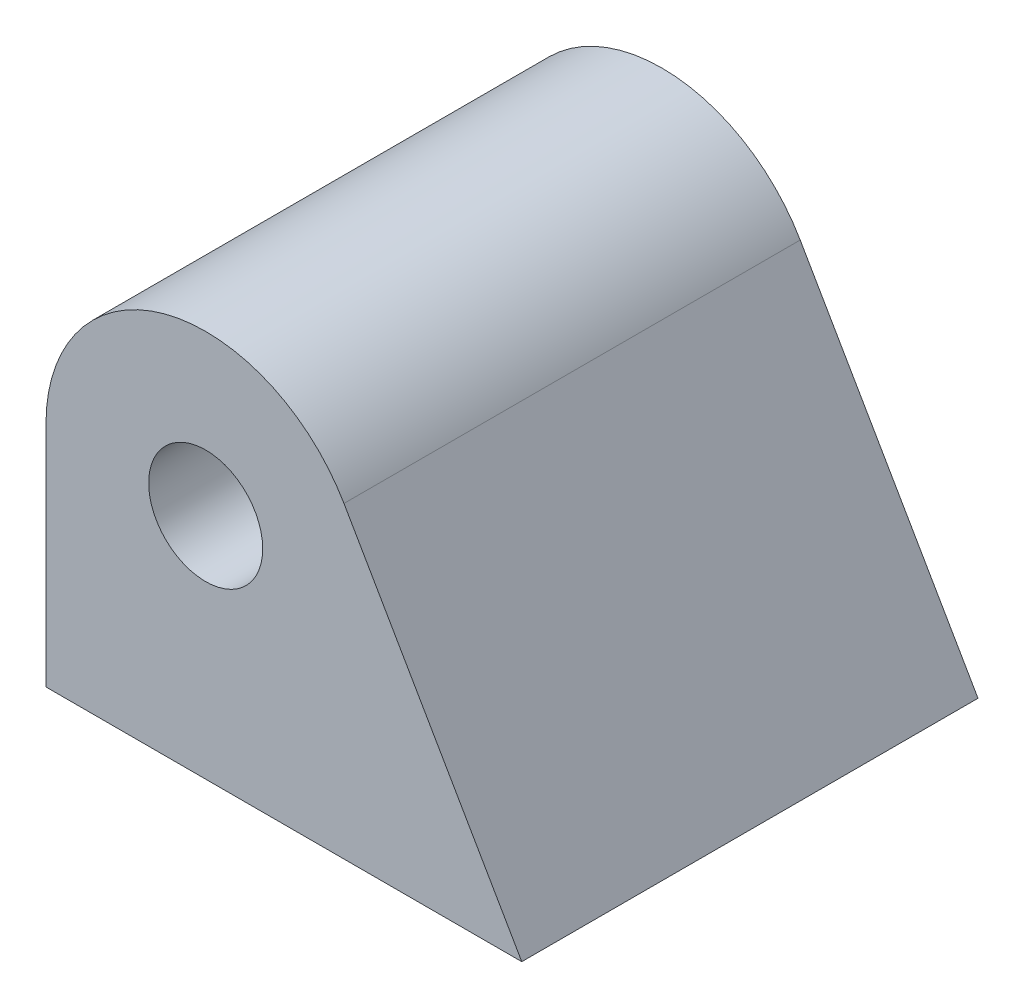
ISO-10303-21;
HEADER;
FILE_DESCRIPTION(('STEP AP214'),'2;1');
FILE_NAME('part.step','',(''),(''),'','','');
FILE_SCHEMA(('AUTOMOTIVE_DESIGN { 1 0 10303 214 1 1 1 1 }'));
ENDSEC;
DATA;
#1=APPLICATION_CONTEXT('core data for automotive mechanical design processes');
#2=APPLICATION_PROTOCOL_DEFINITION('international standard','automotive_design',2000,#1);
#3=PRODUCT_CONTEXT('',#1,'mechanical');
#4=PRODUCT('Part','Part','',(#3));
#5=PRODUCT_RELATED_PRODUCT_CATEGORY('part','',(#4));
#6=PRODUCT_DEFINITION_FORMATION('','',#4);
#7=PRODUCT_DEFINITION_CONTEXT('part definition',#1,'design');
#8=PRODUCT_DEFINITION('design','',#6,#7);
#9=PRODUCT_DEFINITION_SHAPE('','',#8);
#10=(LENGTH_UNIT() NAMED_UNIT(*) SI_UNIT(.MILLI.,.METRE.));
#11=(NAMED_UNIT(*) PLANE_ANGLE_UNIT() SI_UNIT($,.RADIAN.));
#12=(NAMED_UNIT(*) SI_UNIT($,.STERADIAN.) SOLID_ANGLE_UNIT());
#13=UNCERTAINTY_MEASURE_WITH_UNIT(LENGTH_MEASURE(1.E-05),#10,'distance_accuracy_value','');
#14=(GEOMETRIC_REPRESENTATION_CONTEXT(3) GLOBAL_UNCERTAINTY_ASSIGNED_CONTEXT((#13)) GLOBAL_UNIT_ASSIGNED_CONTEXT((#10,
#11,#12)) REPRESENTATION_CONTEXT('',''));
#15=CARTESIAN_POINT('',(0.,0.,0.));
#16=DIRECTION('',(0.,0.,1.));
#17=DIRECTION('',(1.,0.,0.));
#18=AXIS2_PLACEMENT_3D('',#15,#16,#17);
#19=CARTESIAN_POINT('',(8.89,12.7,25.4));
#20=DIRECTION('',(0.,0.,-1.));
#21=DIRECTION('',(-1.,0.,0.));
#22=AXIS2_PLACEMENT_3D('',#19,#20,#21);
#23=PLANE('',#22);
#24=DIRECTION('',(0.,-1.,0.));
#25=VECTOR('',#24,1.);
#26=CARTESIAN_POINT('',(0.,0.,25.4));
#27=LINE('',#26,#25);
#28=CARTESIAN_POINT('',(0.,12.7,25.4));
#29=VERTEX_POINT('',#28);
#30=CARTESIAN_POINT('',(0.,0.,25.4));
#31=VERTEX_POINT('',#30);
#32=EDGE_CURVE('E87',#29,#31,#27,.T.);
#33=ORIENTED_EDGE('',*,*,#32,.T.);
#34=DIRECTION('',(1.,0.,0.));
#35=VECTOR('',#34,1.);
#36=CARTESIAN_POINT('',(0.,0.,25.4));
#37=LINE('',#36,#35);
#38=CARTESIAN_POINT('',(26.4876362048998,0.,25.4));
#39=VERTEX_POINT('',#38);
#40=EDGE_CURVE('E82',#31,#39,#37,.T.);
#41=ORIENTED_EDGE('',*,*,#40,.T.);
#42=DIRECTION('',(-0.500000000000001,0.866025403784438,0.));
#43=VECTOR('',#42,1.);
#44=CARTESIAN_POINT('',(26.4876362048998,0.,25.4));
#45=LINE('',#44,#43);
#46=CARTESIAN_POINT('',(16.5889658396436,17.145,25.4));
#47=VERTEX_POINT('',#46);
#48=EDGE_CURVE('E85',#39,#47,#45,.T.);
#49=ORIENTED_EDGE('',*,*,#48,.T.);
#50=CARTESIAN_POINT('',(8.89,12.7,25.4));
#51=DIRECTION('',(0.,0.,1.));
#52=DIRECTION('',(-1.,0.,0.));
#53=AXIS2_PLACEMENT_3D('',#50,#51,#52);
#54=CIRCLE('',#53,8.88999999999999);
#55=EDGE_CURVE('E52',#47,#29,#54,.T.);
#56=ORIENTED_EDGE('',*,*,#55,.T.);
#57=EDGE_LOOP('',(#33,#41,#49,#56));
#58=FACE_BOUND('',#57,.T.);
#59=CARTESIAN_POINT('',(8.89,12.7,25.4));
#60=DIRECTION('',(0.,0.,1.));
#61=DIRECTION('',(1.,0.,0.));
#62=AXIS2_PLACEMENT_3D('',#59,#60,#61);
#63=CIRCLE('',#62,3.175);
#64=CARTESIAN_POINT('',(12.065,12.7,25.4));
#65=VERTEX_POINT('',#64);
#66=EDGE_CURVE('E102',#65,#65,#63,.T.);
#67=ORIENTED_EDGE('',*,*,#66,.F.);
#68=EDGE_LOOP('',(#67));
#69=FACE_BOUND('',#68,.T.);
#70=ADVANCED_FACE('F35',(#58,#69),#23,.F.);
#71=CARTESIAN_POINT('',(8.89,12.7,0.));
#72=DIRECTION('',(0.,0.,-1.));
#73=DIRECTION('',(-1.,0.,0.));
#74=AXIS2_PLACEMENT_3D('',#71,#72,#73);
#75=PLANE('',#74);
#76=DIRECTION('',(0.,-1.,0.));
#77=VECTOR('',#76,1.);
#78=CARTESIAN_POINT('',(0.,0.,0.));
#79=LINE('',#78,#77);
#80=CARTESIAN_POINT('',(0.,12.7,0.));
#81=VERTEX_POINT('',#80);
#82=CARTESIAN_POINT('',(0.,0.,0.));
#83=VERTEX_POINT('',#82);
#84=EDGE_CURVE('E99',#81,#83,#79,.T.);
#85=ORIENTED_EDGE('',*,*,#84,.F.);
#86=CARTESIAN_POINT('',(8.89,12.7,0.));
#87=DIRECTION('',(0.,0.,1.));
#88=DIRECTION('',(-1.,0.,0.));
#89=AXIS2_PLACEMENT_3D('',#86,#87,#88);
#90=CIRCLE('',#89,8.88999999999999);
#91=CARTESIAN_POINT('',(16.5889658396436,17.145,0.));
#92=VERTEX_POINT('',#91);
#93=EDGE_CURVE('E75',#92,#81,#90,.T.);
#94=ORIENTED_EDGE('',*,*,#93,.F.);
#95=DIRECTION('',(-0.500000000000001,0.866025403784438,0.));
#96=VECTOR('',#95,1.);
#97=CARTESIAN_POINT('',(26.4876362048998,0.,0.));
#98=LINE('',#97,#96);
#99=CARTESIAN_POINT('',(26.4876362048998,0.,0.));
#100=VERTEX_POINT('',#99);
#101=EDGE_CURVE('E69',#100,#92,#98,.T.);
#102=ORIENTED_EDGE('',*,*,#101,.F.);
#103=DIRECTION('',(1.,0.,0.));
#104=VECTOR('',#103,1.);
#105=CARTESIAN_POINT('',(0.,0.,0.));
#106=LINE('',#105,#104);
#107=EDGE_CURVE('E91',#83,#100,#106,.T.);
#108=ORIENTED_EDGE('',*,*,#107,.F.);
#109=EDGE_LOOP('',(#85,#94,#102,#108));
#110=FACE_BOUND('',#109,.T.);
#111=CARTESIAN_POINT('',(8.89,12.7,0.));
#112=DIRECTION('',(0.,0.,1.));
#113=DIRECTION('',(1.,0.,0.));
#114=AXIS2_PLACEMENT_3D('',#111,#112,#113);
#115=CIRCLE('',#114,3.175);
#116=CARTESIAN_POINT('',(12.065,12.7,0.));
#117=VERTEX_POINT('',#116);
#118=EDGE_CURVE('E114',#117,#117,#115,.T.);
#119=ORIENTED_EDGE('',*,*,#118,.T.);
#120=EDGE_LOOP('',(#119));
#121=FACE_BOUND('',#120,.T.);
#122=ADVANCED_FACE('F110',(#110,#121),#75,.T.);
#123=CARTESIAN_POINT('',(0.,0.,25.4));
#124=DIRECTION('',(1.,0.,0.));
#125=DIRECTION('',(0.,0.,-1.));
#126=AXIS2_PLACEMENT_3D('',#123,#124,#125);
#127=PLANE('',#126);
#128=ORIENTED_EDGE('',*,*,#84,.T.);
#129=DIRECTION('',(0.,0.,-1.));
#130=VECTOR('',#129,1.);
#131=CARTESIAN_POINT('',(0.,0.,25.4));
#132=LINE('',#131,#130);
#133=EDGE_CURVE('E11',#31,#83,#132,.T.);
#134=ORIENTED_EDGE('',*,*,#133,.F.);
#135=ORIENTED_EDGE('',*,*,#32,.F.);
#136=DIRECTION('',(0.,0.,-1.));
#137=VECTOR('',#136,1.);
#138=CARTESIAN_POINT('',(0.,12.7,25.4));
#139=LINE('',#138,#137);
#140=EDGE_CURVE('E95',#29,#81,#139,.T.);
#141=ORIENTED_EDGE('',*,*,#140,.T.);
#142=EDGE_LOOP('',(#128,#134,#135,#141));
#143=FACE_BOUND('',#142,.T.);
#144=ADVANCED_FACE('F37',(#143),#127,.F.);
#145=CARTESIAN_POINT('',(0.,0.,25.4));
#146=DIRECTION('',(0.,1.,0.));
#147=DIRECTION('',(-1.,0.,0.));
#148=AXIS2_PLACEMENT_3D('',#145,#146,#147);
#149=PLANE('',#148);
#150=ORIENTED_EDGE('',*,*,#107,.T.);
#151=DIRECTION('',(0.,0.,-1.));
#152=VECTOR('',#151,1.);
#153=CARTESIAN_POINT('',(26.4876362048998,0.,25.4));
#154=LINE('',#153,#152);
#155=EDGE_CURVE('E44',#39,#100,#154,.T.);
#156=ORIENTED_EDGE('',*,*,#155,.F.);
#157=ORIENTED_EDGE('',*,*,#40,.F.);
#158=ORIENTED_EDGE('',*,*,#133,.T.);
#159=EDGE_LOOP('',(#150,#156,#157,#158));
#160=FACE_BOUND('',#159,.T.);
#161=ADVANCED_FACE('F90',(#160),#149,.F.);
#162=CARTESIAN_POINT('',(26.4876362048998,0.,25.4));
#163=DIRECTION('',(-0.866025403784438,-0.500000000000001,0.));
#164=DIRECTION('',(0.500000000000001,-0.866025403784438,0.));
#165=AXIS2_PLACEMENT_3D('',#162,#163,#164);
#166=PLANE('',#165);
#167=ORIENTED_EDGE('',*,*,#101,.T.);
#168=DIRECTION('',(0.,0.,-1.));
#169=VECTOR('',#168,1.);
#170=CARTESIAN_POINT('',(16.5889658396436,17.145,25.4));
#171=LINE('',#170,#169);
#172=EDGE_CURVE('E92',#47,#92,#171,.T.);
#173=ORIENTED_EDGE('',*,*,#172,.F.);
#174=ORIENTED_EDGE('',*,*,#48,.F.);
#175=ORIENTED_EDGE('',*,*,#155,.T.);
#176=EDGE_LOOP('',(#167,#173,#174,#175));
#177=FACE_BOUND('',#176,.T.);
#178=ADVANCED_FACE('F93',(#177),#166,.F.);
#179=CARTESIAN_POINT('',(8.89,12.7,25.4));
#180=DIRECTION('',(0.,0.,-1.));
#181=DIRECTION('',(-1.,0.,0.));
#182=AXIS2_PLACEMENT_3D('',#179,#180,#181);
#183=CYLINDRICAL_SURFACE('',#182,8.88999999999999);
#184=ORIENTED_EDGE('',*,*,#93,.T.);
#185=ORIENTED_EDGE('',*,*,#140,.F.);
#186=ORIENTED_EDGE('',*,*,#55,.F.);
#187=ORIENTED_EDGE('',*,*,#172,.T.);
#188=EDGE_LOOP('',(#184,#185,#186,#187));
#189=FACE_BOUND('',#188,.T.);
#190=ADVANCED_FACE('F107',(#189),#183,.T.);
#191=CARTESIAN_POINT('',(8.89,12.7,25.4));
#192=DIRECTION('',(0.,0.,-1.));
#193=DIRECTION('',(-1.,0.,0.));
#194=AXIS2_PLACEMENT_3D('',#191,#192,#193);
#195=CYLINDRICAL_SURFACE('',#194,3.175);
#196=ORIENTED_EDGE('',*,*,#66,.T.);
#197=EDGE_LOOP('',(#196));
#198=FACE_BOUND('',#197,.T.);
#199=ORIENTED_EDGE('',*,*,#118,.F.);
#200=EDGE_LOOP('',(#199));
#201=FACE_BOUND('',#200,.T.);
#202=ADVANCED_FACE('F120',(#198,#201),#195,.F.);
#203=CLOSED_SHELL('',(#70,#122,#144,#161,#178,#190,#202));
#204=MANIFOLD_SOLID_BREP('B2',#203);
#205=ADVANCED_BREP_SHAPE_REPRESENTATION('',(#18,#204),#14);
#206=SHAPE_DEFINITION_REPRESENTATION(#9,#205);
ENDSEC;
END-ISO-10303-21;
